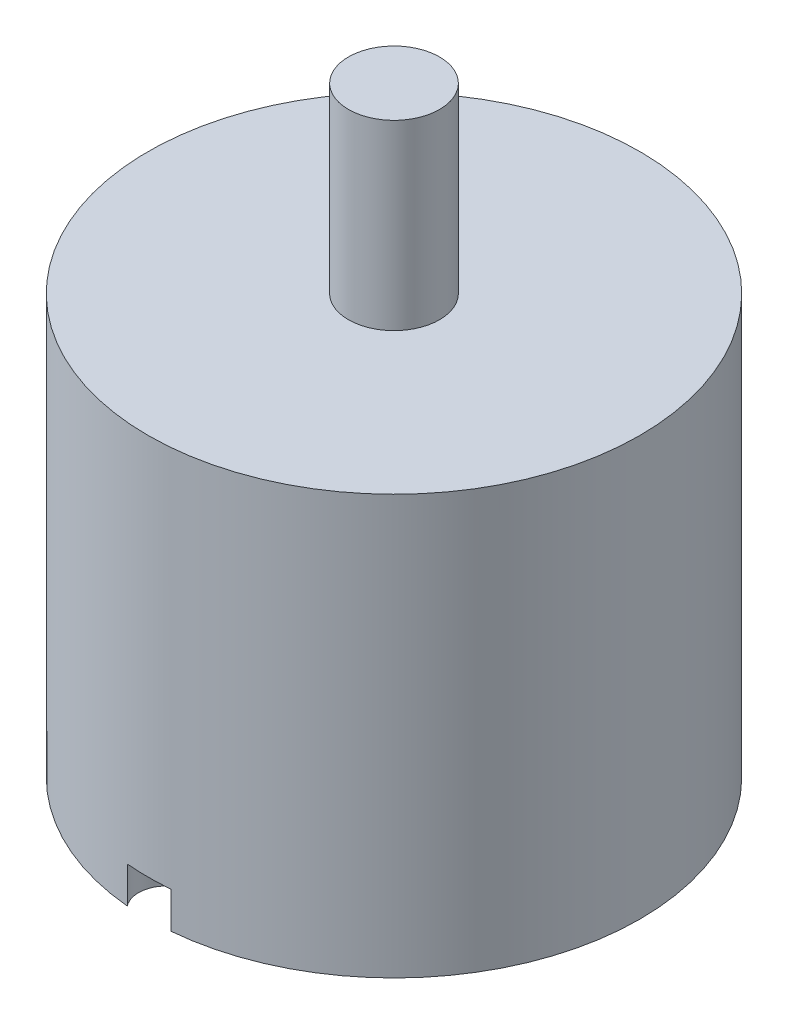
ISO-10303-21;
HEADER;
FILE_DESCRIPTION(('STEP AP214'),'2;1');
FILE_NAME('part.step','',(''),(''),'','','');
FILE_SCHEMA(('AUTOMOTIVE_DESIGN { 1 0 10303 214 1 1 1 1 }'));
ENDSEC;
DATA;
#1=APPLICATION_CONTEXT('core data for automotive mechanical design processes');
#2=APPLICATION_PROTOCOL_DEFINITION('international standard','automotive_design',2000,#1);
#3=PRODUCT_CONTEXT('',#1,'mechanical');
#4=PRODUCT('Part','Part','',(#3));
#5=PRODUCT_RELATED_PRODUCT_CATEGORY('part','',(#4));
#6=PRODUCT_DEFINITION_FORMATION('','',#4);
#7=PRODUCT_DEFINITION_CONTEXT('part definition',#1,'design');
#8=PRODUCT_DEFINITION('design','',#6,#7);
#9=PRODUCT_DEFINITION_SHAPE('','',#8);
#10=(LENGTH_UNIT() NAMED_UNIT(*) SI_UNIT(.MILLI.,.METRE.));
#11=(NAMED_UNIT(*) PLANE_ANGLE_UNIT() SI_UNIT($,.RADIAN.));
#12=(NAMED_UNIT(*) SI_UNIT($,.STERADIAN.) SOLID_ANGLE_UNIT());
#13=UNCERTAINTY_MEASURE_WITH_UNIT(LENGTH_MEASURE(1.E-05),#10,'distance_accuracy_value','');
#14=(GEOMETRIC_REPRESENTATION_CONTEXT(3) GLOBAL_UNCERTAINTY_ASSIGNED_CONTEXT((#13)) GLOBAL_UNIT_ASSIGNED_CONTEXT((#10,
#11,#12)) REPRESENTATION_CONTEXT('',''));
#15=CARTESIAN_POINT('',(0.,0.,0.));
#16=DIRECTION('',(0.,0.,1.));
#17=DIRECTION('',(1.,0.,0.));
#18=AXIS2_PLACEMENT_3D('',#15,#16,#17);
#19=CARTESIAN_POINT('',(0.,0.,0.));
#20=DIRECTION('',(0.,1.,0.));
#21=DIRECTION('',(0.,0.,1.));
#22=AXIS2_PLACEMENT_3D('',#19,#20,#21);
#23=PLANE('',#22);
#24=CARTESIAN_POINT('',(-9.4999937,0.,0.));
#25=DIRECTION('',(0.,-1.,0.));
#26=DIRECTION('',(0.,0.,1.));
#27=AXIS2_PLACEMENT_3D('',#24,#25,#26);
#28=CIRCLE('',#27,1.5);
#29=CARTESIAN_POINT('',(-9.4999937,0.,1.5));
#30=VERTEX_POINT('',#29);
#31=EDGE_CURVE('E269',#30,#30,#28,.T.);
#32=ORIENTED_EDGE('',*,*,#31,.F.);
#33=EDGE_LOOP('',(#32));
#34=FACE_BOUND('',#33,.T.);
#35=CARTESIAN_POINT('',(9.4999937,0.,0.));
#36=DIRECTION('',(0.,-1.,0.));
#37=DIRECTION('',(0.,0.,-1.));
#38=AXIS2_PLACEMENT_3D('',#35,#36,#37);
#39=CIRCLE('',#38,1.5);
#40=CARTESIAN_POINT('',(9.4999937,0.,-1.5));
#41=VERTEX_POINT('',#40);
#42=EDGE_CURVE('E120',#41,#41,#39,.T.);
#43=ORIENTED_EDGE('',*,*,#42,.F.);
#44=EDGE_LOOP('',(#43));
#45=FACE_BOUND('',#44,.T.);
#46=CARTESIAN_POINT('',(0.,0.,0.));
#47=DIRECTION('',(0.,1.,0.));
#48=DIRECTION('',(0.,0.,1.));
#49=AXIS2_PLACEMENT_3D('',#46,#47,#48);
#50=CIRCLE('',#49,13.499973);
#51=CARTESIAN_POINT('',(-1.19400142261471,0.,-13.447067769723));
#52=VERTEX_POINT('',#51);
#53=CARTESIAN_POINT('',(-1.19400142261471,0.,13.447067769723));
#54=VERTEX_POINT('',#53);
#55=EDGE_CURVE('E84',#52,#54,#50,.T.);
#56=ORIENTED_EDGE('',*,*,#55,.F.);
#57=CARTESIAN_POINT('',(0.,0.,-12.5000004));
#58=DIRECTION('',(0.,-1.,0.));
#59=DIRECTION('',(0.,0.,1.));
#60=AXIS2_PLACEMENT_3D('',#57,#58,#59);
#61=CIRCLE('',#60,1.524);
#62=CARTESIAN_POINT('',(1.19400142261471,0.,-13.447067769723));
#63=VERTEX_POINT('',#62);
#64=EDGE_CURVE('E72',#63,#52,#61,.T.);
#65=ORIENTED_EDGE('',*,*,#64,.F.);
#66=CARTESIAN_POINT('',(1.19400142261471,0.,13.447067769723));
#67=VERTEX_POINT('',#66);
#68=EDGE_CURVE('E90',#67,#63,#50,.T.);
#69=ORIENTED_EDGE('',*,*,#68,.F.);
#70=CARTESIAN_POINT('',(0.,0.,12.5000004));
#71=DIRECTION('',(0.,-1.,0.));
#72=DIRECTION('',(0.,0.,-1.));
#73=AXIS2_PLACEMENT_3D('',#70,#71,#72);
#74=CIRCLE('',#73,1.524);
#75=EDGE_CURVE('E89',#54,#67,#74,.T.);
#76=ORIENTED_EDGE('',*,*,#75,.F.);
#77=EDGE_LOOP('',(#56,#65,#69,#76));
#78=FACE_BOUND('',#77,.T.);
#79=CARTESIAN_POINT('',(0.,0.,0.));
#80=DIRECTION('',(0.,1.,0.));
#81=DIRECTION('',(0.,0.,1.));
#82=AXIS2_PLACEMENT_3D('',#79,#80,#81);
#83=CIRCLE('',#82,1.499997);
#84=CARTESIAN_POINT('',(0.,0.,1.499997));
#85=VERTEX_POINT('',#84);
#86=EDGE_CURVE('E100',#85,#85,#83,.F.);
#87=ORIENTED_EDGE('',*,*,#86,.F.);
#88=EDGE_LOOP('',(#87));
#89=FACE_BOUND('',#88,.T.);
#90=ADVANCED_FACE('F32',(#34,#45,#78,#89),#23,.F.);
#91=CARTESIAN_POINT('',(0.,23.0000048,0.));
#92=DIRECTION('',(0.,1.,0.));
#93=DIRECTION('',(0.,0.,1.));
#94=AXIS2_PLACEMENT_3D('',#91,#92,#93);
#95=PLANE('',#94);
#96=CARTESIAN_POINT('',(0.,23.0000048,0.));
#97=DIRECTION('',(0.,1.,0.));
#98=DIRECTION('',(0.,0.,1.));
#99=AXIS2_PLACEMENT_3D('',#96,#97,#98);
#100=CIRCLE('',#99,13.499973);
#101=CARTESIAN_POINT('',(0.,23.0000048,13.499973));
#102=VERTEX_POINT('',#101);
#103=EDGE_CURVE('E93',#102,#102,#100,.T.);
#104=ORIENTED_EDGE('',*,*,#103,.T.);
#105=EDGE_LOOP('',(#104));
#106=FACE_BOUND('',#105,.T.);
#107=CARTESIAN_POINT('',(0.,23.0000048,0.));
#108=DIRECTION('',(0.,1.,0.));
#109=DIRECTION('',(0.,0.,1.));
#110=AXIS2_PLACEMENT_3D('',#107,#108,#109);
#111=CIRCLE('',#110,2.5);
#112=CARTESIAN_POINT('',(0.,23.0000048,2.5));
#113=VERTEX_POINT('',#112);
#114=EDGE_CURVE('E95',#113,#113,#111,.T.);
#115=ORIENTED_EDGE('',*,*,#114,.F.);
#116=EDGE_LOOP('',(#115));
#117=FACE_BOUND('',#116,.T.);
#118=ADVANCED_FACE('F127',(#106,#117),#95,.T.);
#119=CARTESIAN_POINT('',(0.,23.0000048,0.));
#120=DIRECTION('',(0.,-1.,0.));
#121=DIRECTION('',(0.,0.,-1.));
#122=AXIS2_PLACEMENT_3D('',#119,#120,#121);
#123=CYLINDRICAL_SURFACE('',#122,13.499973);
#124=ORIENTED_EDGE('',*,*,#68,.T.);
#125=DIRECTION('',(0.,-1.,0.));
#126=VECTOR('',#125,1.);
#127=CARTESIAN_POINT('',(1.19400142261471,1.,-13.447067769723));
#128=LINE('',#127,#126);
#129=CARTESIAN_POINT('',(1.19400142261471,2.,-13.447067769723));
#130=VERTEX_POINT('',#129);
#131=EDGE_CURVE('E11',#63,#130,#128,.F.);
#132=ORIENTED_EDGE('',*,*,#131,.T.);
#133=CARTESIAN_POINT('',(0.,2.,0.));
#134=DIRECTION('',(0.,1.,0.));
#135=DIRECTION('',(0.,0.,1.));
#136=AXIS2_PLACEMENT_3D('',#133,#134,#135);
#137=CIRCLE('',#136,13.499973);
#138=CARTESIAN_POINT('',(-1.19400142261471,2.,-13.447067769723));
#139=VERTEX_POINT('',#138);
#140=EDGE_CURVE('E86',#130,#139,#137,.T.);
#141=ORIENTED_EDGE('',*,*,#140,.T.);
#142=DIRECTION('',(0.,-1.,0.));
#143=VECTOR('',#142,1.);
#144=CARTESIAN_POINT('',(-1.19400142261471,1.,-13.447067769723));
#145=LINE('',#144,#143);
#146=EDGE_CURVE('E40',#139,#52,#145,.T.);
#147=ORIENTED_EDGE('',*,*,#146,.T.);
#148=ORIENTED_EDGE('',*,*,#55,.T.);
#149=DIRECTION('',(0.,-1.,0.));
#150=VECTOR('',#149,1.);
#151=CARTESIAN_POINT('',(-1.19400142261471,1.,13.447067769723));
#152=LINE('',#151,#150);
#153=CARTESIAN_POINT('',(-1.19400142261471,2.,13.447067769723));
#154=VERTEX_POINT('',#153);
#155=EDGE_CURVE('E108',#54,#154,#152,.F.);
#156=ORIENTED_EDGE('',*,*,#155,.T.);
#157=CARTESIAN_POINT('',(0.,2.,0.));
#158=DIRECTION('',(0.,-1.,0.));
#159=DIRECTION('',(0.,0.,-1.));
#160=AXIS2_PLACEMENT_3D('',#157,#158,#159);
#161=CIRCLE('',#160,13.499973);
#162=CARTESIAN_POINT('',(1.19400142261471,2.,13.447067769723));
#163=VERTEX_POINT('',#162);
#164=EDGE_CURVE('E103',#163,#154,#161,.T.);
#165=ORIENTED_EDGE('',*,*,#164,.F.);
#166=DIRECTION('',(0.,-1.,0.));
#167=VECTOR('',#166,1.);
#168=CARTESIAN_POINT('',(1.19400142261471,1.,13.447067769723));
#169=LINE('',#168,#167);
#170=EDGE_CURVE('E105',#163,#67,#169,.T.);
#171=ORIENTED_EDGE('',*,*,#170,.T.);
#172=EDGE_LOOP('',(#124,#132,#141,#147,#148,#156,#165,#171));
#173=FACE_BOUND('',#172,.T.);
#174=ORIENTED_EDGE('',*,*,#103,.F.);
#175=EDGE_LOOP('',(#174));
#176=FACE_BOUND('',#175,.T.);
#177=ADVANCED_FACE('F34',(#173,#176),#123,.T.);
#178=CARTESIAN_POINT('',(0.,33.0000048,0.));
#179=DIRECTION('',(0.,-1.,0.));
#180=DIRECTION('',(0.,0.,-1.));
#181=AXIS2_PLACEMENT_3D('',#178,#179,#180);
#182=CYLINDRICAL_SURFACE('',#181,2.5);
#183=CARTESIAN_POINT('',(0.,33.0000048,0.));
#184=DIRECTION('',(0.,1.,0.));
#185=DIRECTION('',(0.,0.,1.));
#186=AXIS2_PLACEMENT_3D('',#183,#184,#185);
#187=CIRCLE('',#186,2.5);
#188=CARTESIAN_POINT('',(0.,33.0000048,2.5));
#189=VERTEX_POINT('',#188);
#190=EDGE_CURVE('E91',#189,#189,#187,.T.);
#191=ORIENTED_EDGE('',*,*,#190,.F.);
#192=EDGE_LOOP('',(#191));
#193=FACE_BOUND('',#192,.T.);
#194=ORIENTED_EDGE('',*,*,#114,.T.);
#195=EDGE_LOOP('',(#194));
#196=FACE_BOUND('',#195,.T.);
#197=ADVANCED_FACE('F125',(#193,#196),#182,.T.);
#198=CARTESIAN_POINT('',(0.,33.0000048,0.));
#199=DIRECTION('',(0.,1.,0.));
#200=DIRECTION('',(0.,0.,1.));
#201=AXIS2_PLACEMENT_3D('',#198,#199,#200);
#202=PLANE('',#201);
#203=ORIENTED_EDGE('',*,*,#190,.T.);
#204=EDGE_LOOP('',(#203));
#205=FACE_BOUND('',#204,.T.);
#206=ADVANCED_FACE('F140',(#205),#202,.T.);
#207=CARTESIAN_POINT('',(0.,-2.,0.));
#208=DIRECTION('',(0.,1.,0.));
#209=DIRECTION('',(0.,0.,1.));
#210=AXIS2_PLACEMENT_3D('',#207,#208,#209);
#211=CYLINDRICAL_SURFACE('',#210,1.499997);
#212=CARTESIAN_POINT('',(0.,-2.,0.));
#213=DIRECTION('',(0.,-1.,0.));
#214=DIRECTION('',(0.,0.,-1.));
#215=AXIS2_PLACEMENT_3D('',#212,#213,#214);
#216=CIRCLE('',#215,1.499997);
#217=CARTESIAN_POINT('',(0.,-2.,-1.499997));
#218=VERTEX_POINT('',#217);
#219=EDGE_CURVE('E113',#218,#218,#216,.T.);
#220=ORIENTED_EDGE('',*,*,#219,.F.);
#221=EDGE_LOOP('',(#220));
#222=FACE_BOUND('',#221,.T.);
#223=ORIENTED_EDGE('',*,*,#86,.T.);
#224=EDGE_LOOP('',(#223));
#225=FACE_BOUND('',#224,.T.);
#226=ADVANCED_FACE('F144',(#222,#225),#211,.T.);
#227=CARTESIAN_POINT('',(0.,-2.,0.));
#228=DIRECTION('',(0.,-1.,0.));
#229=DIRECTION('',(0.,0.,-1.));
#230=AXIS2_PLACEMENT_3D('',#227,#228,#229);
#231=PLANE('',#230);
#232=ORIENTED_EDGE('',*,*,#219,.T.);
#233=EDGE_LOOP('',(#232));
#234=FACE_BOUND('',#233,.T.);
#235=ADVANCED_FACE('F148',(#234),#231,.T.);
#236=CARTESIAN_POINT('',(0.,2.,12.5000004));
#237=DIRECTION('',(0.,-1.,0.));
#238=DIRECTION('',(0.,0.,-1.));
#239=AXIS2_PLACEMENT_3D('',#236,#237,#238);
#240=CYLINDRICAL_SURFACE('',#239,1.524);
#241=ORIENTED_EDGE('',*,*,#75,.T.);
#242=ORIENTED_EDGE('',*,*,#170,.F.);
#243=CARTESIAN_POINT('',(0.,2.,12.5000004));
#244=DIRECTION('',(0.,-1.,0.));
#245=DIRECTION('',(0.,0.,-1.));
#246=AXIS2_PLACEMENT_3D('',#243,#244,#245);
#247=CIRCLE('',#246,1.524);
#248=EDGE_CURVE('E53',#154,#163,#247,.T.);
#249=ORIENTED_EDGE('',*,*,#248,.F.);
#250=ORIENTED_EDGE('',*,*,#155,.F.);
#251=EDGE_LOOP('',(#241,#242,#249,#250));
#252=FACE_BOUND('',#251,.T.);
#253=ADVANCED_FACE('F112',(#252),#240,.F.);
#254=CARTESIAN_POINT('',(0.,2.,12.5000004));
#255=DIRECTION('',(0.,-1.,0.));
#256=DIRECTION('',(0.,0.,-1.));
#257=AXIS2_PLACEMENT_3D('',#254,#255,#256);
#258=PLANE('',#257);
#259=ORIENTED_EDGE('',*,*,#164,.T.);
#260=ORIENTED_EDGE('',*,*,#248,.T.);
#261=EDGE_LOOP('',(#259,#260));
#262=FACE_BOUND('',#261,.T.);
#263=ADVANCED_FACE('F155',(#262),#258,.T.);
#264=CARTESIAN_POINT('',(9.4999937,2.,0.));
#265=DIRECTION('',(0.,-1.,0.));
#266=DIRECTION('',(0.,0.,-1.));
#267=AXIS2_PLACEMENT_3D('',#264,#265,#266);
#268=CYLINDRICAL_SURFACE('',#267,1.5);
#269=CARTESIAN_POINT('',(9.4999937,2.,0.));
#270=DIRECTION('',(0.,-1.,0.));
#271=DIRECTION('',(0.,0.,-1.));
#272=AXIS2_PLACEMENT_3D('',#269,#270,#271);
#273=CIRCLE('',#272,1.5);
#274=CARTESIAN_POINT('',(9.4999937,2.,-1.5));
#275=VERTEX_POINT('',#274);
#276=EDGE_CURVE('E117',#275,#275,#273,.T.);
#277=ORIENTED_EDGE('',*,*,#276,.F.);
#278=EDGE_LOOP('',(#277));
#279=FACE_BOUND('',#278,.T.);
#280=ORIENTED_EDGE('',*,*,#42,.T.);
#281=EDGE_LOOP('',(#280));
#282=FACE_BOUND('',#281,.T.);
#283=ADVANCED_FACE('F158',(#279,#282),#268,.F.);
#284=CARTESIAN_POINT('',(9.4999937,2.,0.));
#285=DIRECTION('',(0.,-1.,0.));
#286=DIRECTION('',(0.,0.,-1.));
#287=AXIS2_PLACEMENT_3D('',#284,#285,#286);
#288=PLANE('',#287);
#289=ORIENTED_EDGE('',*,*,#276,.T.);
#290=EDGE_LOOP('',(#289));
#291=FACE_BOUND('',#290,.T.);
#292=ADVANCED_FACE('F161',(#291),#288,.T.);
#293=CARTESIAN_POINT('',(-9.4999937,2.,0.));
#294=DIRECTION('',(0.,-1.,0.));
#295=DIRECTION('',(0.,0.,-1.));
#296=AXIS2_PLACEMENT_3D('',#293,#294,#295);
#297=CYLINDRICAL_SURFACE('',#296,1.5);
#298=CARTESIAN_POINT('',(-9.4999937,2.,0.));
#299=DIRECTION('',(0.,-1.,0.));
#300=DIRECTION('',(0.,0.,1.));
#301=AXIS2_PLACEMENT_3D('',#298,#299,#300);
#302=CIRCLE('',#301,1.5);
#303=CARTESIAN_POINT('',(-9.4999937,2.,1.5));
#304=VERTEX_POINT('',#303);
#305=EDGE_CURVE('E268',#304,#304,#302,.T.);
#306=ORIENTED_EDGE('',*,*,#305,.F.);
#307=EDGE_LOOP('',(#306));
#308=FACE_BOUND('',#307,.T.);
#309=ORIENTED_EDGE('',*,*,#31,.T.);
#310=EDGE_LOOP('',(#309));
#311=FACE_BOUND('',#310,.T.);
#312=ADVANCED_FACE('F165',(#308,#311),#297,.F.);
#313=CARTESIAN_POINT('',(-9.4999937,2.,0.));
#314=DIRECTION('',(0.,1.,0.));
#315=DIRECTION('',(0.,0.,1.));
#316=AXIS2_PLACEMENT_3D('',#313,#314,#315);
#317=PLANE('',#316);
#318=ORIENTED_EDGE('',*,*,#305,.T.);
#319=EDGE_LOOP('',(#318));
#320=FACE_BOUND('',#319,.T.);
#321=ADVANCED_FACE('F169',(#320),#317,.F.);
#322=CARTESIAN_POINT('',(0.,2.,-12.5000004));
#323=DIRECTION('',(0.,-1.,0.));
#324=DIRECTION('',(0.,0.,-1.));
#325=AXIS2_PLACEMENT_3D('',#322,#323,#324);
#326=CYLINDRICAL_SURFACE('',#325,1.524);
#327=ORIENTED_EDGE('',*,*,#64,.T.);
#328=ORIENTED_EDGE('',*,*,#146,.F.);
#329=CARTESIAN_POINT('',(0.,2.,-12.5000004));
#330=DIRECTION('',(0.,-1.,0.));
#331=DIRECTION('',(0.,0.,1.));
#332=AXIS2_PLACEMENT_3D('',#329,#330,#331);
#333=CIRCLE('',#332,1.524);
#334=EDGE_CURVE('E46',#130,#139,#333,.T.);
#335=ORIENTED_EDGE('',*,*,#334,.F.);
#336=ORIENTED_EDGE('',*,*,#131,.F.);
#337=EDGE_LOOP('',(#327,#328,#335,#336));
#338=FACE_BOUND('',#337,.T.);
#339=ADVANCED_FACE('F74',(#338),#326,.F.);
#340=CARTESIAN_POINT('',(0.,2.,-12.5000004));
#341=DIRECTION('',(0.,1.,0.));
#342=DIRECTION('',(0.,0.,1.));
#343=AXIS2_PLACEMENT_3D('',#340,#341,#342);
#344=PLANE('',#343);
#345=ORIENTED_EDGE('',*,*,#334,.T.);
#346=ORIENTED_EDGE('',*,*,#140,.F.);
#347=EDGE_LOOP('',(#345,#346));
#348=FACE_BOUND('',#347,.T.);
#349=ADVANCED_FACE('F176',(#348),#344,.F.);
#350=CLOSED_SHELL('',(#90,#118,#177,#197,#206,#226,#235,#253,#263,#283,#292,#312,#321,#339,#349));
#351=MANIFOLD_SOLID_BREP('B2',#350);
#352=ADVANCED_BREP_SHAPE_REPRESENTATION('',(#18,#351),#14);
#353=SHAPE_DEFINITION_REPRESENTATION(#9,#352);
ENDSEC;
END-ISO-10303-21;
